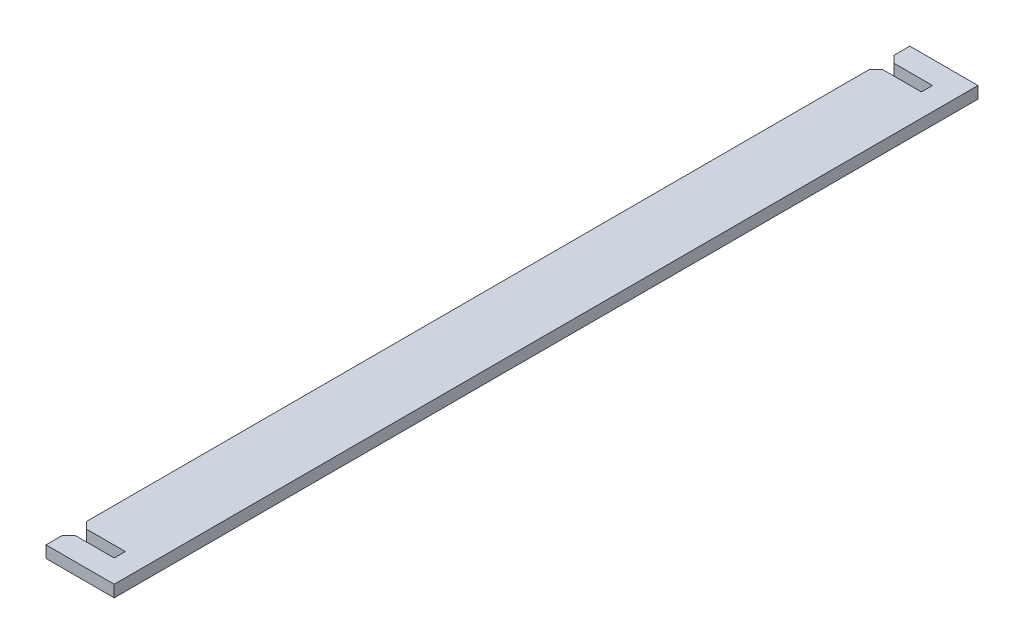
ISO-10303-21;
HEADER;
FILE_DESCRIPTION(('STEP AP214'),'2;1');
FILE_NAME('part.step','',(''),(''),'','','');
FILE_SCHEMA(('AUTOMOTIVE_DESIGN { 1 0 10303 214 1 1 1 1 }'));
ENDSEC;
DATA;
#1=APPLICATION_CONTEXT('core data for automotive mechanical design processes');
#2=APPLICATION_PROTOCOL_DEFINITION('international standard','automotive_design',2000,#1);
#3=PRODUCT_CONTEXT('',#1,'mechanical');
#4=PRODUCT('Part','Part','',(#3));
#5=PRODUCT_RELATED_PRODUCT_CATEGORY('part','',(#4));
#6=PRODUCT_DEFINITION_FORMATION('','',#4);
#7=PRODUCT_DEFINITION_CONTEXT('part definition',#1,'design');
#8=PRODUCT_DEFINITION('design','',#6,#7);
#9=PRODUCT_DEFINITION_SHAPE('','',#8);
#10=(LENGTH_UNIT() NAMED_UNIT(*) SI_UNIT(.MILLI.,.METRE.));
#11=(NAMED_UNIT(*) PLANE_ANGLE_UNIT() SI_UNIT($,.RADIAN.));
#12=(NAMED_UNIT(*) SI_UNIT($,.STERADIAN.) SOLID_ANGLE_UNIT());
#13=UNCERTAINTY_MEASURE_WITH_UNIT(LENGTH_MEASURE(1.E-05),#10,'distance_accuracy_value','');
#14=(GEOMETRIC_REPRESENTATION_CONTEXT(3) GLOBAL_UNCERTAINTY_ASSIGNED_CONTEXT((#13)) GLOBAL_UNIT_ASSIGNED_CONTEXT((#10,
#11,#12)) REPRESENTATION_CONTEXT('',''));
#15=CARTESIAN_POINT('',(0.,0.,0.));
#16=DIRECTION('',(0.,0.,1.));
#17=DIRECTION('',(1.,0.,0.));
#18=AXIS2_PLACEMENT_3D('',#15,#16,#17);
#19=CARTESIAN_POINT('',(0.,5.2,0.));
#20=DIRECTION('',(1.,0.,0.));
#21=DIRECTION('',(0.,0.,-1.));
#22=AXIS2_PLACEMENT_3D('',#19,#20,#21);
#23=PLANE('',#22);
#24=DIRECTION('',(0.,0.,1.));
#25=VECTOR('',#24,1.);
#26=CARTESIAN_POINT('',(0.,0.,0.));
#27=LINE('',#26,#25);
#28=CARTESIAN_POINT('',(0.,0.,-380.));
#29=VERTEX_POINT('',#28);
#30=CARTESIAN_POINT('',(0.,0.,-373.));
#31=VERTEX_POINT('',#30);
#32=EDGE_CURVE('E204',#29,#31,#27,.T.);
#33=ORIENTED_EDGE('',*,*,#32,.T.);
#34=DIRECTION('',(0.,1.,0.));
#35=VECTOR('',#34,1.);
#36=CARTESIAN_POINT('',(0.,5.2,-373.));
#37=LINE('',#36,#35);
#38=CARTESIAN_POINT('',(0.,5.2,-373.));
#39=VERTEX_POINT('',#38);
#40=EDGE_CURVE('E44',#31,#39,#37,.T.);
#41=ORIENTED_EDGE('',*,*,#40,.T.);
#42=DIRECTION('',(0.,0.,1.));
#43=VECTOR('',#42,1.);
#44=CARTESIAN_POINT('',(0.,5.2,0.));
#45=LINE('',#44,#43);
#46=CARTESIAN_POINT('',(0.,5.2,-380.));
#47=VERTEX_POINT('',#46);
#48=EDGE_CURVE('E192',#47,#39,#45,.T.);
#49=ORIENTED_EDGE('',*,*,#48,.F.);
#50=DIRECTION('',(0.,-1.,0.));
#51=VECTOR('',#50,1.);
#52=CARTESIAN_POINT('',(0.,5.2,-380.));
#53=LINE('',#52,#51);
#54=EDGE_CURVE('E203',#47,#29,#53,.T.);
#55=ORIENTED_EDGE('',*,*,#54,.T.);
#56=EDGE_LOOP('',(#33,#41,#49,#55));
#57=FACE_BOUND('',#56,.T.);
#58=ADVANCED_FACE('F35',(#57),#23,.F.);
#59=CARTESIAN_POINT('',(0.,0.,-362.1));
#60=VERTEX_POINT('',#59);
#61=CARTESIAN_POINT('',(0.,0.,-17.8999999999999));
#62=VERTEX_POINT('',#61);
#63=EDGE_CURVE('E208',#60,#62,#27,.T.);
#64=ORIENTED_EDGE('',*,*,#63,.T.);
#65=DIRECTION('',(0.,1.,0.));
#66=VECTOR('',#65,1.);
#67=CARTESIAN_POINT('',(0.,5.2,-17.8999999999999));
#68=LINE('',#67,#66);
#69=CARTESIAN_POINT('',(0.,5.2,-17.8999999999999));
#70=VERTEX_POINT('',#69);
#71=EDGE_CURVE('E259',#62,#70,#68,.T.);
#72=ORIENTED_EDGE('',*,*,#71,.T.);
#73=CARTESIAN_POINT('',(0.,5.2,-362.1));
#74=VERTEX_POINT('',#73);
#75=EDGE_CURVE('E196',#74,#70,#45,.T.);
#76=ORIENTED_EDGE('',*,*,#75,.F.);
#77=DIRECTION('',(0.,-1.,0.));
#78=VECTOR('',#77,1.);
#79=CARTESIAN_POINT('',(0.,5.2,-362.1));
#80=LINE('',#79,#78);
#81=EDGE_CURVE('E257',#74,#60,#80,.T.);
#82=ORIENTED_EDGE('',*,*,#81,.T.);
#83=EDGE_LOOP('',(#64,#72,#76,#82));
#84=FACE_BOUND('',#83,.T.);
#85=ADVANCED_FACE('F291',(#84),#23,.F.);
#86=CARTESIAN_POINT('',(0.,5.2,-7.00000000000011));
#87=VERTEX_POINT('',#86);
#88=CARTESIAN_POINT('',(0.,5.2,0.));
#89=VERTEX_POINT('',#88);
#90=EDGE_CURVE('E197',#87,#89,#45,.T.);
#91=ORIENTED_EDGE('',*,*,#90,.F.);
#92=DIRECTION('',(0.,-1.,0.));
#93=VECTOR('',#92,1.);
#94=CARTESIAN_POINT('',(0.,5.2,-7.00000000000011));
#95=LINE('',#94,#93);
#96=CARTESIAN_POINT('',(0.,0.,-7.00000000000011));
#97=VERTEX_POINT('',#96);
#98=EDGE_CURVE('E249',#87,#97,#95,.T.);
#99=ORIENTED_EDGE('',*,*,#98,.T.);
#100=CARTESIAN_POINT('',(0.,0.,0.));
#101=VERTEX_POINT('',#100);
#102=EDGE_CURVE('E178',#97,#101,#27,.T.);
#103=ORIENTED_EDGE('',*,*,#102,.T.);
#104=DIRECTION('',(0.,-1.,0.));
#105=VECTOR('',#104,1.);
#106=CARTESIAN_POINT('',(0.,5.2,0.));
#107=LINE('',#106,#105);
#108=EDGE_CURVE('E222',#89,#101,#107,.T.);
#109=ORIENTED_EDGE('',*,*,#108,.F.);
#110=EDGE_LOOP('',(#91,#99,#103,#109));
#111=FACE_BOUND('',#110,.T.);
#112=ADVANCED_FACE('F301',(#111),#23,.F.);
#113=CARTESIAN_POINT('',(0.,5.2,0.));
#114=DIRECTION('',(0.,0.,-1.));
#115=DIRECTION('',(-1.,0.,0.));
#116=AXIS2_PLACEMENT_3D('',#113,#114,#115);
#117=PLANE('',#116);
#118=DIRECTION('',(1.,0.,0.));
#119=VECTOR('',#118,1.);
#120=CARTESIAN_POINT('',(0.,0.,0.));
#121=LINE('',#120,#119);
#122=CARTESIAN_POINT('',(30.,0.,0.));
#123=VERTEX_POINT('',#122);
#124=EDGE_CURVE('E207',#101,#123,#121,.T.);
#125=ORIENTED_EDGE('',*,*,#124,.T.);
#126=DIRECTION('',(0.,-1.,0.));
#127=VECTOR('',#126,1.);
#128=CARTESIAN_POINT('',(30.,5.2,0.));
#129=LINE('',#128,#127);
#130=CARTESIAN_POINT('',(30.,5.2,0.));
#131=VERTEX_POINT('',#130);
#132=EDGE_CURVE('E219',#131,#123,#129,.T.);
#133=ORIENTED_EDGE('',*,*,#132,.F.);
#134=DIRECTION('',(1.,0.,0.));
#135=VECTOR('',#134,1.);
#136=CARTESIAN_POINT('',(0.,5.2,0.));
#137=LINE('',#136,#135);
#138=EDGE_CURVE('E195',#89,#131,#137,.T.);
#139=ORIENTED_EDGE('',*,*,#138,.F.);
#140=ORIENTED_EDGE('',*,*,#108,.T.);
#141=EDGE_LOOP('',(#125,#133,#139,#140));
#142=FACE_BOUND('',#141,.T.);
#143=ADVANCED_FACE('F300',(#142),#117,.F.);
#144=CARTESIAN_POINT('',(30.,5.2,0.));
#145=DIRECTION('',(-1.,0.,0.));
#146=DIRECTION('',(0.,0.,1.));
#147=AXIS2_PLACEMENT_3D('',#144,#145,#146);
#148=PLANE('',#147);
#149=DIRECTION('',(0.,0.,-1.));
#150=VECTOR('',#149,1.);
#151=CARTESIAN_POINT('',(30.,0.,0.));
#152=LINE('',#151,#150);
#153=CARTESIAN_POINT('',(29.9999999999999,0.,-380.));
#154=VERTEX_POINT('',#153);
#155=EDGE_CURVE('E210',#123,#154,#152,.T.);
#156=ORIENTED_EDGE('',*,*,#155,.T.);
#157=DIRECTION('',(0.,-1.,0.));
#158=VECTOR('',#157,1.);
#159=CARTESIAN_POINT('',(29.9999999999999,5.2,-380.));
#160=LINE('',#159,#158);
#161=CARTESIAN_POINT('',(29.9999999999999,5.2,-380.));
#162=VERTEX_POINT('',#161);
#163=EDGE_CURVE('E216',#162,#154,#160,.T.);
#164=ORIENTED_EDGE('',*,*,#163,.F.);
#165=DIRECTION('',(0.,0.,-1.));
#166=VECTOR('',#165,1.);
#167=CARTESIAN_POINT('',(30.,5.2,0.));
#168=LINE('',#167,#166);
#169=EDGE_CURVE('E199',#131,#162,#168,.T.);
#170=ORIENTED_EDGE('',*,*,#169,.F.);
#171=ORIENTED_EDGE('',*,*,#132,.T.);
#172=EDGE_LOOP('',(#156,#164,#170,#171));
#173=FACE_BOUND('',#172,.T.);
#174=ADVANCED_FACE('F305',(#173),#148,.F.);
#175=CARTESIAN_POINT('',(0.,5.2,-380.));
#176=DIRECTION('',(0.,0.,1.));
#177=DIRECTION('',(1.,0.,0.));
#178=AXIS2_PLACEMENT_3D('',#175,#176,#177);
#179=PLANE('',#178);
#180=DIRECTION('',(-1.,0.,0.));
#181=VECTOR('',#180,1.);
#182=CARTESIAN_POINT('',(0.,0.,-380.));
#183=LINE('',#182,#181);
#184=EDGE_CURVE('E212',#154,#29,#183,.T.);
#185=ORIENTED_EDGE('',*,*,#184,.T.);
#186=ORIENTED_EDGE('',*,*,#54,.F.);
#187=DIRECTION('',(-1.,0.,0.));
#188=VECTOR('',#187,1.);
#189=CARTESIAN_POINT('',(0.,5.2,-380.));
#190=LINE('',#189,#188);
#191=EDGE_CURVE('E201',#162,#47,#190,.T.);
#192=ORIENTED_EDGE('',*,*,#191,.F.);
#193=ORIENTED_EDGE('',*,*,#163,.T.);
#194=EDGE_LOOP('',(#185,#186,#192,#193));
#195=FACE_BOUND('',#194,.T.);
#196=ADVANCED_FACE('F276',(#195),#179,.F.);
#197=CARTESIAN_POINT('',(0.,5.2,0.));
#198=DIRECTION('',(0.,-1.,0.));
#199=DIRECTION('',(0.,0.,-1.));
#200=AXIS2_PLACEMENT_3D('',#197,#198,#199);
#201=PLANE('',#200);
#202=DIRECTION('',(1.,0.,0.));
#203=VECTOR('',#202,1.);
#204=CARTESIAN_POINT('',(0.,5.2,-10.));
#205=LINE('',#204,#203);
#206=CARTESIAN_POINT('',(2.99999999999989,5.2,-10.));
#207=VERTEX_POINT('',#206);
#208=CARTESIAN_POINT('',(20.,5.2,-10.));
#209=VERTEX_POINT('',#208);
#210=EDGE_CURVE('E180',#207,#209,#205,.T.);
#211=ORIENTED_EDGE('',*,*,#210,.F.);
#212=DIRECTION('',(0.707106781186548,0.,-0.707106781186548));
#213=VECTOR('',#212,1.);
#214=CARTESIAN_POINT('',(2.99999999999989,5.2,-10.));
#215=LINE('',#214,#213);
#216=EDGE_CURVE('E247',#207,#87,#215,.F.);
#217=ORIENTED_EDGE('',*,*,#216,.T.);
#218=ORIENTED_EDGE('',*,*,#90,.T.);
#219=ORIENTED_EDGE('',*,*,#138,.T.);
#220=ORIENTED_EDGE('',*,*,#169,.T.);
#221=ORIENTED_EDGE('',*,*,#191,.T.);
#222=ORIENTED_EDGE('',*,*,#48,.T.);
#223=DIRECTION('',(-0.707106781186541,0.,-0.707106781186554));
#224=VECTOR('',#223,1.);
#225=CARTESIAN_POINT('',(0.,5.2,-373.));
#226=LINE('',#225,#224);
#227=CARTESIAN_POINT('',(2.99999999999994,5.2,-370.));
#228=VERTEX_POINT('',#227);
#229=EDGE_CURVE('E241',#39,#228,#226,.F.);
#230=ORIENTED_EDGE('',*,*,#229,.T.);
#231=DIRECTION('',(-1.,0.,0.));
#232=VECTOR('',#231,1.);
#233=CARTESIAN_POINT('',(0.,5.2,-370.));
#234=LINE('',#233,#232);
#235=CARTESIAN_POINT('',(19.9999999999999,5.2,-370.));
#236=VERTEX_POINT('',#235);
#237=EDGE_CURVE('E170',#236,#228,#234,.T.);
#238=ORIENTED_EDGE('',*,*,#237,.F.);
#239=DIRECTION('',(0.,0.,-1.));
#240=VECTOR('',#239,1.);
#241=CARTESIAN_POINT('',(19.9999999999999,5.2,-370.));
#242=LINE('',#241,#240);
#243=CARTESIAN_POINT('',(19.9999999999999,5.2,-365.1));
#244=VERTEX_POINT('',#243);
#245=EDGE_CURVE('E159',#244,#236,#242,.T.);
#246=ORIENTED_EDGE('',*,*,#245,.F.);
#247=DIRECTION('',(1.,0.,0.));
#248=VECTOR('',#247,1.);
#249=CARTESIAN_POINT('',(0.,5.2,-365.1));
#250=LINE('',#249,#248);
#251=CARTESIAN_POINT('',(2.99999999999989,5.2,-365.1));
#252=VERTEX_POINT('',#251);
#253=EDGE_CURVE('E150',#252,#244,#250,.T.);
#254=ORIENTED_EDGE('',*,*,#253,.F.);
#255=DIRECTION('',(0.707106781186548,0.,-0.707106781186548));
#256=VECTOR('',#255,1.);
#257=CARTESIAN_POINT('',(2.99999999999989,5.2,-365.1));
#258=LINE('',#257,#256);
#259=EDGE_CURVE('E243',#252,#74,#258,.F.);
#260=ORIENTED_EDGE('',*,*,#259,.T.);
#261=ORIENTED_EDGE('',*,*,#75,.T.);
#262=DIRECTION('',(-0.707106781186547,0.,-0.707106781186548));
#263=VECTOR('',#262,1.);
#264=CARTESIAN_POINT('',(0.,5.2,-17.8999999999999));
#265=LINE('',#264,#263);
#266=CARTESIAN_POINT('',(2.99999999999989,5.2,-14.9));
#267=VERTEX_POINT('',#266);
#268=EDGE_CURVE('E245',#70,#267,#265,.F.);
#269=ORIENTED_EDGE('',*,*,#268,.T.);
#270=DIRECTION('',(-1.,0.,0.));
#271=VECTOR('',#270,1.);
#272=CARTESIAN_POINT('',(0.,5.2,-14.9));
#273=LINE('',#272,#271);
#274=CARTESIAN_POINT('',(20.,5.2,-14.9));
#275=VERTEX_POINT('',#274);
#276=EDGE_CURVE('E185',#275,#267,#273,.T.);
#277=ORIENTED_EDGE('',*,*,#276,.F.);
#278=DIRECTION('',(0.,0.,-1.));
#279=VECTOR('',#278,1.);
#280=CARTESIAN_POINT('',(20.,5.2,-14.9));
#281=LINE('',#280,#279);
#282=EDGE_CURVE('E182',#209,#275,#281,.T.);
#283=ORIENTED_EDGE('',*,*,#282,.F.);
#284=EDGE_LOOP('',(#211,#217,#218,#219,#220,#221,#222,#230,#238,#246,#254,#260,#261,#269,#277,#283));
#285=FACE_BOUND('',#284,.T.);
#286=ADVANCED_FACE('F173',(#285),#201,.F.);
#287=CARTESIAN_POINT('',(0.,0.,0.));
#288=DIRECTION('',(0.,-1.,0.));
#289=DIRECTION('',(0.,0.,-1.));
#290=AXIS2_PLACEMENT_3D('',#287,#288,#289);
#291=PLANE('',#290);
#292=ORIENTED_EDGE('',*,*,#102,.F.);
#293=DIRECTION('',(-0.707106781186548,0.,0.707106781186548));
#294=VECTOR('',#293,1.);
#295=CARTESIAN_POINT('',(-3.50000000000006,0.,-3.50000000000006));
#296=LINE('',#295,#294);
#297=CARTESIAN_POINT('',(2.99999999999989,0.,-10.));
#298=VERTEX_POINT('',#297);
#299=EDGE_CURVE('E255',#97,#298,#296,.F.);
#300=ORIENTED_EDGE('',*,*,#299,.T.);
#301=DIRECTION('',(-1.,0.,0.));
#302=VECTOR('',#301,1.);
#303=CARTESIAN_POINT('',(0.,0.,-10.));
#304=LINE('',#303,#302);
#305=CARTESIAN_POINT('',(20.,0.,-10.));
#306=VERTEX_POINT('',#305);
#307=EDGE_CURVE('E225',#306,#298,#304,.T.);
#308=ORIENTED_EDGE('',*,*,#307,.F.);
#309=DIRECTION('',(0.,0.,1.));
#310=VECTOR('',#309,1.);
#311=CARTESIAN_POINT('',(20.,0.,0.));
#312=LINE('',#311,#310);
#313=CARTESIAN_POINT('',(20.,0.,-14.9));
#314=VERTEX_POINT('',#313);
#315=EDGE_CURVE('E228',#314,#306,#312,.T.);
#316=ORIENTED_EDGE('',*,*,#315,.F.);
#317=DIRECTION('',(1.,0.,0.));
#318=VECTOR('',#317,1.);
#319=CARTESIAN_POINT('',(0.,0.,-14.9));
#320=LINE('',#319,#318);
#321=CARTESIAN_POINT('',(2.99999999999989,0.,-14.9));
#322=VERTEX_POINT('',#321);
#323=EDGE_CURVE('E231',#322,#314,#320,.T.);
#324=ORIENTED_EDGE('',*,*,#323,.F.);
#325=DIRECTION('',(0.707106781186547,0.,0.707106781186548));
#326=VECTOR('',#325,1.);
#327=CARTESIAN_POINT('',(8.94999999999996,0.,-8.94999999999995));
#328=LINE('',#327,#326);
#329=EDGE_CURVE('E57',#322,#62,#328,.F.);
#330=ORIENTED_EDGE('',*,*,#329,.T.);
#331=ORIENTED_EDGE('',*,*,#63,.F.);
#332=DIRECTION('',(-0.707106781186548,0.,0.707106781186548));
#333=VECTOR('',#332,1.);
#334=CARTESIAN_POINT('',(-181.05,0.,-181.05));
#335=LINE('',#334,#333);
#336=CARTESIAN_POINT('',(2.99999999999989,0.,-365.1));
#337=VERTEX_POINT('',#336);
#338=EDGE_CURVE('E51',#60,#337,#335,.F.);
#339=ORIENTED_EDGE('',*,*,#338,.T.);
#340=DIRECTION('',(-1.,0.,0.));
#341=VECTOR('',#340,1.);
#342=CARTESIAN_POINT('',(0.,0.,-365.1));
#343=LINE('',#342,#341);
#344=CARTESIAN_POINT('',(19.9999999999999,0.,-365.1));
#345=VERTEX_POINT('',#344);
#346=EDGE_CURVE('E233',#345,#337,#343,.T.);
#347=ORIENTED_EDGE('',*,*,#346,.F.);
#348=DIRECTION('',(0.,0.,1.));
#349=VECTOR('',#348,1.);
#350=CARTESIAN_POINT('',(20.0000000000002,0.,0.));
#351=LINE('',#350,#349);
#352=CARTESIAN_POINT('',(19.9999999999999,0.,-370.));
#353=VERTEX_POINT('',#352);
#354=EDGE_CURVE('E168',#353,#345,#351,.T.);
#355=ORIENTED_EDGE('',*,*,#354,.F.);
#356=DIRECTION('',(1.,0.,0.));
#357=VECTOR('',#356,1.);
#358=CARTESIAN_POINT('',(0.,0.,-370.));
#359=LINE('',#358,#357);
#360=CARTESIAN_POINT('',(2.99999999999994,0.,-370.));
#361=VERTEX_POINT('',#360);
#362=EDGE_CURVE('E236',#361,#353,#359,.T.);
#363=ORIENTED_EDGE('',*,*,#362,.F.);
#364=DIRECTION('',(0.707106781186541,0.,0.707106781186554));
#365=VECTOR('',#364,1.);
#366=CARTESIAN_POINT('',(186.5,0.,-186.499999999997));
#367=LINE('',#366,#365);
#368=EDGE_CURVE('E251',#361,#31,#367,.F.);
#369=ORIENTED_EDGE('',*,*,#368,.T.);
#370=ORIENTED_EDGE('',*,*,#32,.F.);
#371=ORIENTED_EDGE('',*,*,#184,.F.);
#372=ORIENTED_EDGE('',*,*,#155,.F.);
#373=ORIENTED_EDGE('',*,*,#124,.F.);
#374=EDGE_LOOP('',(#292,#300,#308,#316,#324,#330,#331,#339,#347,#355,#363,#369,#370,#371,#372,#373));
#375=FACE_BOUND('',#374,.T.);
#376=ADVANCED_FACE('F279',(#375),#291,.T.);
#377=CARTESIAN_POINT('',(0.,-4.8,-14.9));
#378=DIRECTION('',(0.,0.,-1.));
#379=DIRECTION('',(-1.,0.,0.));
#380=AXIS2_PLACEMENT_3D('',#377,#378,#379);
#381=PLANE('',#380);
#382=ORIENTED_EDGE('',*,*,#276,.T.);
#383=DIRECTION('',(0.,-1.,0.));
#384=VECTOR('',#383,1.);
#385=CARTESIAN_POINT('',(2.99999999999989,-4.8,-14.9));
#386=LINE('',#385,#384);
#387=EDGE_CURVE('E262',#267,#322,#386,.T.);
#388=ORIENTED_EDGE('',*,*,#387,.T.);
#389=ORIENTED_EDGE('',*,*,#323,.T.);
#390=DIRECTION('',(0.,1.,0.));
#391=VECTOR('',#390,1.);
#392=CARTESIAN_POINT('',(20.,-4.8,-14.9));
#393=LINE('',#392,#391);
#394=EDGE_CURVE('E160',#314,#275,#393,.T.);
#395=ORIENTED_EDGE('',*,*,#394,.T.);
#396=EDGE_LOOP('',(#382,#388,#389,#395));
#397=FACE_BOUND('',#396,.T.);
#398=ADVANCED_FACE('F353',(#397),#381,.F.);
#399=CARTESIAN_POINT('',(20.,-4.8,-14.9));
#400=DIRECTION('',(1.,0.,0.));
#401=DIRECTION('',(0.,0.,-1.));
#402=AXIS2_PLACEMENT_3D('',#399,#400,#401);
#403=PLANE('',#402);
#404=ORIENTED_EDGE('',*,*,#315,.T.);
#405=DIRECTION('',(0.,1.,0.));
#406=VECTOR('',#405,1.);
#407=CARTESIAN_POINT('',(20.,-4.8,-10.));
#408=LINE('',#407,#406);
#409=EDGE_CURVE('E188',#306,#209,#408,.T.);
#410=ORIENTED_EDGE('',*,*,#409,.T.);
#411=ORIENTED_EDGE('',*,*,#282,.T.);
#412=ORIENTED_EDGE('',*,*,#394,.F.);
#413=EDGE_LOOP('',(#404,#410,#411,#412));
#414=FACE_BOUND('',#413,.T.);
#415=ADVANCED_FACE('F347',(#414),#403,.F.);
#416=CARTESIAN_POINT('',(0.,-4.8,-10.));
#417=DIRECTION('',(0.,0.,1.));
#418=DIRECTION('',(1.,0.,0.));
#419=AXIS2_PLACEMENT_3D('',#416,#417,#418);
#420=PLANE('',#419);
#421=ORIENTED_EDGE('',*,*,#307,.T.);
#422=DIRECTION('',(0.,1.,0.));
#423=VECTOR('',#422,1.);
#424=CARTESIAN_POINT('',(2.99999999999989,-4.8,-10.));
#425=LINE('',#424,#423);
#426=EDGE_CURVE('E238',#298,#207,#425,.T.);
#427=ORIENTED_EDGE('',*,*,#426,.T.);
#428=ORIENTED_EDGE('',*,*,#210,.T.);
#429=ORIENTED_EDGE('',*,*,#409,.F.);
#430=EDGE_LOOP('',(#421,#427,#428,#429));
#431=FACE_BOUND('',#430,.T.);
#432=ADVANCED_FACE('F352',(#431),#420,.F.);
#433=CARTESIAN_POINT('',(0.,-4.8,-370.));
#434=DIRECTION('',(0.,0.,-1.));
#435=DIRECTION('',(-1.,0.,0.));
#436=AXIS2_PLACEMENT_3D('',#433,#434,#435);
#437=PLANE('',#436);
#438=ORIENTED_EDGE('',*,*,#237,.T.);
#439=DIRECTION('',(0.,-1.,0.));
#440=VECTOR('',#439,1.);
#441=CARTESIAN_POINT('',(2.99999999999994,-4.8,-370.));
#442=LINE('',#441,#440);
#443=EDGE_CURVE('E11',#228,#361,#442,.T.);
#444=ORIENTED_EDGE('',*,*,#443,.T.);
#445=ORIENTED_EDGE('',*,*,#362,.T.);
#446=DIRECTION('',(0.,1.,0.));
#447=VECTOR('',#446,1.);
#448=CARTESIAN_POINT('',(19.9999999999999,-4.8,-370.));
#449=LINE('',#448,#447);
#450=EDGE_CURVE('E169',#353,#236,#449,.T.);
#451=ORIENTED_EDGE('',*,*,#450,.T.);
#452=EDGE_LOOP('',(#438,#444,#445,#451));
#453=FACE_BOUND('',#452,.T.);
#454=ADVANCED_FACE('F284',(#453),#437,.F.);
#455=CARTESIAN_POINT('',(19.9999999999999,-4.8,-370.));
#456=DIRECTION('',(1.,0.,0.));
#457=DIRECTION('',(0.,0.,-1.));
#458=AXIS2_PLACEMENT_3D('',#455,#456,#457);
#459=PLANE('',#458);
#460=ORIENTED_EDGE('',*,*,#354,.T.);
#461=DIRECTION('',(0.,1.,0.));
#462=VECTOR('',#461,1.);
#463=CARTESIAN_POINT('',(19.9999999999999,-4.8,-365.1));
#464=LINE('',#463,#462);
#465=EDGE_CURVE('E153',#345,#244,#464,.T.);
#466=ORIENTED_EDGE('',*,*,#465,.T.);
#467=ORIENTED_EDGE('',*,*,#245,.T.);
#468=ORIENTED_EDGE('',*,*,#450,.F.);
#469=EDGE_LOOP('',(#460,#466,#467,#468));
#470=FACE_BOUND('',#469,.T.);
#471=ADVANCED_FACE('F164',(#470),#459,.F.);
#472=CARTESIAN_POINT('',(0.,-4.8,-365.1));
#473=DIRECTION('',(0.,0.,1.));
#474=DIRECTION('',(1.,0.,0.));
#475=AXIS2_PLACEMENT_3D('',#472,#473,#474);
#476=PLANE('',#475);
#477=ORIENTED_EDGE('',*,*,#346,.T.);
#478=DIRECTION('',(0.,1.,0.));
#479=VECTOR('',#478,1.);
#480=CARTESIAN_POINT('',(2.99999999999989,-4.8,-365.1));
#481=LINE('',#480,#479);
#482=EDGE_CURVE('E156',#337,#252,#481,.T.);
#483=ORIENTED_EDGE('',*,*,#482,.T.);
#484=ORIENTED_EDGE('',*,*,#253,.T.);
#485=ORIENTED_EDGE('',*,*,#465,.F.);
#486=EDGE_LOOP('',(#477,#483,#484,#485));
#487=FACE_BOUND('',#486,.T.);
#488=ADVANCED_FACE('F152',(#487),#476,.F.);
#489=CARTESIAN_POINT('',(2.99999999999989,-4.8,-10.));
#490=DIRECTION('',(0.707106781186547,0.,0.707106781186547));
#491=DIRECTION('',(0.,1.,0.));
#492=AXIS2_PLACEMENT_3D('',#489,#490,#491);
#493=PLANE('',#492);
#494=ORIENTED_EDGE('',*,*,#299,.F.);
#495=ORIENTED_EDGE('',*,*,#98,.F.);
#496=ORIENTED_EDGE('',*,*,#216,.F.);
#497=ORIENTED_EDGE('',*,*,#426,.F.);
#498=EDGE_LOOP('',(#494,#495,#496,#497));
#499=FACE_BOUND('',#498,.T.);
#500=ADVANCED_FACE('F418',(#499),#493,.F.);
#501=CARTESIAN_POINT('',(0.,5.2,-17.8999999999999));
#502=DIRECTION('',(0.707106781186548,0.,-0.707106781186547));
#503=DIRECTION('',(0.,1.,0.));
#504=AXIS2_PLACEMENT_3D('',#501,#502,#503);
#505=PLANE('',#504);
#506=ORIENTED_EDGE('',*,*,#329,.F.);
#507=ORIENTED_EDGE('',*,*,#387,.F.);
#508=ORIENTED_EDGE('',*,*,#268,.F.);
#509=ORIENTED_EDGE('',*,*,#71,.F.);
#510=EDGE_LOOP('',(#506,#507,#508,#509));
#511=FACE_BOUND('',#510,.T.);
#512=ADVANCED_FACE('F427',(#511),#505,.F.);
#513=CARTESIAN_POINT('',(2.99999999999989,-4.8,-365.1));
#514=DIRECTION('',(0.707106781186548,0.,0.707106781186548));
#515=DIRECTION('',(0.,1.,0.));
#516=AXIS2_PLACEMENT_3D('',#513,#514,#515);
#517=PLANE('',#516);
#518=ORIENTED_EDGE('',*,*,#338,.F.);
#519=ORIENTED_EDGE('',*,*,#81,.F.);
#520=ORIENTED_EDGE('',*,*,#259,.F.);
#521=ORIENTED_EDGE('',*,*,#482,.F.);
#522=EDGE_LOOP('',(#518,#519,#520,#521));
#523=FACE_BOUND('',#522,.T.);
#524=ADVANCED_FACE('F286',(#523),#517,.F.);
#525=CARTESIAN_POINT('',(0.,5.2,-373.));
#526=DIRECTION('',(0.707106781186554,0.,-0.707106781186541));
#527=DIRECTION('',(0.,1.,0.));
#528=AXIS2_PLACEMENT_3D('',#525,#526,#527);
#529=PLANE('',#528);
#530=ORIENTED_EDGE('',*,*,#368,.F.);
#531=ORIENTED_EDGE('',*,*,#443,.F.);
#532=ORIENTED_EDGE('',*,*,#229,.F.);
#533=ORIENTED_EDGE('',*,*,#40,.F.);
#534=EDGE_LOOP('',(#530,#531,#532,#533));
#535=FACE_BOUND('',#534,.T.);
#536=ADVANCED_FACE('F38',(#535),#529,.F.);
#537=CLOSED_SHELL('',(#58,#85,#112,#143,#174,#196,#286,#376,#398,#415,#432,#454,#471,#488,#500,
#512,#524,#536));
#538=MANIFOLD_SOLID_BREP('B2',#537);
#539=ADVANCED_BREP_SHAPE_REPRESENTATION('',(#18,#538),#14);
#540=SHAPE_DEFINITION_REPRESENTATION(#9,#539);
ENDSEC;
END-ISO-10303-21;
